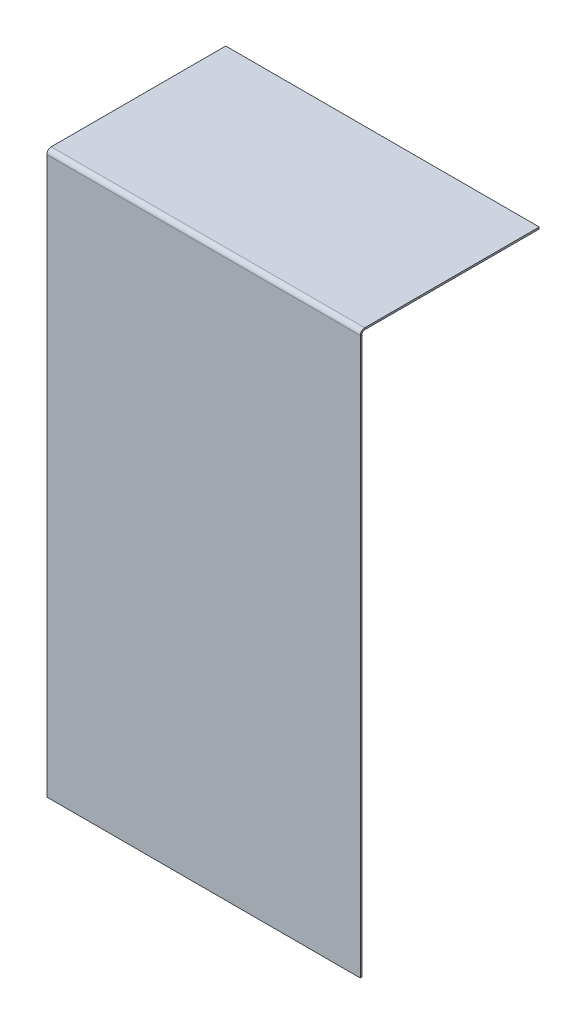
ISO-10303-21;
HEADER;
FILE_DESCRIPTION(('STEP AP214'),'2;1');
FILE_NAME('part.step','',(''),(''),'','','');
FILE_SCHEMA(('AUTOMOTIVE_DESIGN { 1 0 10303 214 1 1 1 1 }'));
ENDSEC;
DATA;
#1=APPLICATION_CONTEXT('core data for automotive mechanical design processes');
#2=APPLICATION_PROTOCOL_DEFINITION('international standard','automotive_design',2000,#1);
#3=PRODUCT_CONTEXT('',#1,'mechanical');
#4=PRODUCT('Part','Part','',(#3));
#5=PRODUCT_RELATED_PRODUCT_CATEGORY('part','',(#4));
#6=PRODUCT_DEFINITION_FORMATION('','',#4);
#7=PRODUCT_DEFINITION_CONTEXT('part definition',#1,'design');
#8=PRODUCT_DEFINITION('design','',#6,#7);
#9=PRODUCT_DEFINITION_SHAPE('','',#8);
#10=(LENGTH_UNIT() NAMED_UNIT(*) SI_UNIT(.MILLI.,.METRE.));
#11=(NAMED_UNIT(*) PLANE_ANGLE_UNIT() SI_UNIT($,.RADIAN.));
#12=(NAMED_UNIT(*) SI_UNIT($,.STERADIAN.) SOLID_ANGLE_UNIT());
#13=UNCERTAINTY_MEASURE_WITH_UNIT(LENGTH_MEASURE(1.E-05),#10,'distance_accuracy_value','');
#14=(GEOMETRIC_REPRESENTATION_CONTEXT(3) GLOBAL_UNCERTAINTY_ASSIGNED_CONTEXT((#13)) GLOBAL_UNIT_ASSIGNED_CONTEXT((#10,
#11,#12)) REPRESENTATION_CONTEXT('',''));
#15=CARTESIAN_POINT('',(0.,0.,0.));
#16=DIRECTION('',(0.,0.,1.));
#17=DIRECTION('',(1.,0.,0.));
#18=AXIS2_PLACEMENT_3D('',#15,#16,#17);
#19=CARTESIAN_POINT('',(-152.826113142533,400.785534507492,157.48));
#20=DIRECTION('',(-1.,0.,0.));
#21=DIRECTION('',(0.,-1.,0.));
#22=AXIS2_PLACEMENT_3D('',#19,#20,#21);
#23=PLANE('',#22);
#24=DIRECTION('',(0.,0.,1.));
#25=VECTOR('',#24,1.);
#26=CARTESIAN_POINT('',(-152.826113142533,398.405534441492,157.48));
#27=LINE('',#26,#25);
#28=CARTESIAN_POINT('',(-152.826113142533,398.405534441492,157.48));
#29=VERTEX_POINT('',#28);
#30=CARTESIAN_POINT('',(-152.826113142533,398.405534441492,159.0675));
#31=VERTEX_POINT('',#30);
#32=EDGE_CURVE('E11',#29,#31,#27,.T.);
#33=ORIENTED_EDGE('',*,*,#32,.F.);
#34=DIRECTION('',(0.,-1.,0.));
#35=VECTOR('',#34,1.);
#36=CARTESIAN_POINT('',(-152.826113142533,400.785534507492,157.48));
#37=LINE('',#36,#35);
#38=CARTESIAN_POINT('',(-152.826113142533,-96.1019654925084,157.48));
#39=VERTEX_POINT('',#38);
#40=EDGE_CURVE('E152',#29,#39,#37,.T.);
#41=ORIENTED_EDGE('',*,*,#40,.T.);
#42=DIRECTION('',(0.,0.,1.));
#43=VECTOR('',#42,1.);
#44=CARTESIAN_POINT('',(-152.826113142533,-96.1019654925084,157.48));
#45=LINE('',#44,#43);
#46=CARTESIAN_POINT('',(-152.826113142533,-96.1019654925084,159.0675));
#47=VERTEX_POINT('',#46);
#48=EDGE_CURVE('E45',#39,#47,#45,.T.);
#49=ORIENTED_EDGE('',*,*,#48,.T.);
#50=DIRECTION('',(0.,-1.,0.));
#51=VECTOR('',#50,1.);
#52=CARTESIAN_POINT('',(-152.826113142533,400.785534507492,159.0675));
#53=LINE('',#52,#51);
#54=EDGE_CURVE('E128',#31,#47,#53,.T.);
#55=ORIENTED_EDGE('',*,*,#54,.F.);
#56=EDGE_LOOP('',(#33,#41,#49,#55));
#57=FACE_BOUND('',#56,.T.);
#58=ADVANCED_FACE('F35',(#57),#23,.T.);
#59=CARTESIAN_POINT('',(-152.826113142533,-96.1019654925084,157.48));
#60=DIRECTION('',(0.,-1.,0.));
#61=DIRECTION('',(1.,0.,0.));
#62=AXIS2_PLACEMENT_3D('',#59,#60,#61);
#63=PLANE('',#62);
#64=ORIENTED_EDGE('',*,*,#48,.F.);
#65=DIRECTION('',(1.,0.,0.));
#66=VECTOR('',#65,1.);
#67=CARTESIAN_POINT('',(-152.826113142533,-96.1019654925084,157.48));
#68=LINE('',#67,#66);
#69=CARTESIAN_POINT('',(125.781386791467,-96.1019654925084,157.48));
#70=VERTEX_POINT('',#69);
#71=EDGE_CURVE('E154',#39,#70,#68,.T.);
#72=ORIENTED_EDGE('',*,*,#71,.T.);
#73=DIRECTION('',(0.,0.,1.));
#74=VECTOR('',#73,1.);
#75=CARTESIAN_POINT('',(125.781386791467,-96.1019654925084,157.48));
#76=LINE('',#75,#74);
#77=CARTESIAN_POINT('',(125.781386791467,-96.1019654925085,159.0675));
#78=VERTEX_POINT('',#77);
#79=EDGE_CURVE('E180',#70,#78,#76,.T.);
#80=ORIENTED_EDGE('',*,*,#79,.T.);
#81=DIRECTION('',(1.,0.,0.));
#82=VECTOR('',#81,1.);
#83=CARTESIAN_POINT('',(-155.206113208533,-96.1019654925084,159.0675));
#84=LINE('',#83,#82);
#85=EDGE_CURVE('E132',#47,#78,#84,.T.);
#86=ORIENTED_EDGE('',*,*,#85,.F.);
#87=EDGE_LOOP('',(#64,#72,#80,#86));
#88=FACE_BOUND('',#87,.T.);
#89=ADVANCED_FACE('F183',(#88),#63,.T.);
#90=CARTESIAN_POINT('',(125.781386791467,400.785534507492,157.48));
#91=DIRECTION('',(1.,0.,0.));
#92=DIRECTION('',(0.,1.,0.));
#93=AXIS2_PLACEMENT_3D('',#90,#91,#92);
#94=PLANE('',#93);
#95=ORIENTED_EDGE('',*,*,#79,.F.);
#96=DIRECTION('',(0.,1.,0.));
#97=VECTOR('',#96,1.);
#98=CARTESIAN_POINT('',(125.781386791467,400.785534507492,157.48));
#99=LINE('',#98,#97);
#100=CARTESIAN_POINT('',(125.781386791467,398.405534441492,157.48));
#101=VERTEX_POINT('',#100);
#102=EDGE_CURVE('E158',#70,#101,#99,.T.);
#103=ORIENTED_EDGE('',*,*,#102,.T.);
#104=DIRECTION('',(0.,0.,1.));
#105=VECTOR('',#104,1.);
#106=CARTESIAN_POINT('',(125.781386791467,398.405534441492,157.48));
#107=LINE('',#106,#105);
#108=CARTESIAN_POINT('',(125.781386791467,398.405534441492,159.0675));
#109=VERTEX_POINT('',#108);
#110=EDGE_CURVE('E178',#101,#109,#107,.T.);
#111=ORIENTED_EDGE('',*,*,#110,.T.);
#112=DIRECTION('',(0.,-1.,0.));
#113=VECTOR('',#112,1.);
#114=CARTESIAN_POINT('',(125.781386791467,400.785534507492,159.0675));
#115=LINE('',#114,#113);
#116=EDGE_CURVE('E137',#78,#109,#115,.F.);
#117=ORIENTED_EDGE('',*,*,#116,.F.);
#118=EDGE_LOOP('',(#95,#103,#111,#117));
#119=FACE_BOUND('',#118,.T.);
#120=ADVANCED_FACE('F187',(#119),#94,.T.);
#121=CARTESIAN_POINT('',(125.781386791467,398.405534441492,155.099999934));
#122=DIRECTION('',(-1.,0.,0.));
#123=DIRECTION('',(0.,-1.,0.));
#124=AXIS2_PLACEMENT_3D('',#121,#122,#123);
#125=PLANE('',#124);
#126=ORIENTED_EDGE('',*,*,#110,.F.);
#127=CARTESIAN_POINT('',(125.781386791467,398.405534441492,155.099999934));
#128=DIRECTION('',(1.,0.,0.));
#129=DIRECTION('',(0.,1.,0.));
#130=AXIS2_PLACEMENT_3D('',#127,#128,#129);
#131=CIRCLE('',#130,2.380000066);
#132=CARTESIAN_POINT('',(125.781386791467,400.785534507492,155.099999934));
#133=VERTEX_POINT('',#132);
#134=EDGE_CURVE('E155',#101,#133,#131,.F.);
#135=ORIENTED_EDGE('',*,*,#134,.T.);
#136=DIRECTION('',(0.,1.,0.));
#137=VECTOR('',#136,1.);
#138=CARTESIAN_POINT('',(125.781386791467,400.785534507492,155.099999934));
#139=LINE('',#138,#137);
#140=CARTESIAN_POINT('',(125.781386791467,402.373034507492,155.099999934));
#141=VERTEX_POINT('',#140);
#142=EDGE_CURVE('E83',#133,#141,#139,.T.);
#143=ORIENTED_EDGE('',*,*,#142,.T.);
#144=CARTESIAN_POINT('',(125.781386791467,398.405534441492,155.099999934));
#145=DIRECTION('',(1.,0.,0.));
#146=DIRECTION('',(0.,0.,-1.));
#147=AXIS2_PLACEMENT_3D('',#144,#145,#146);
#148=CIRCLE('',#147,3.967500066);
#149=EDGE_CURVE('E125',#109,#141,#148,.F.);
#150=ORIENTED_EDGE('',*,*,#149,.F.);
#151=EDGE_LOOP('',(#126,#135,#143,#150));
#152=FACE_BOUND('',#151,.T.);
#153=ADVANCED_FACE('F190',(#152),#125,.F.);
#154=CARTESIAN_POINT('',(125.781386791467,400.785534507492,727.1459781624));
#155=DIRECTION('',(-1.,0.,0.));
#156=DIRECTION('',(0.,0.,-1.));
#157=AXIS2_PLACEMENT_3D('',#154,#155,#156);
#158=PLANE('',#157);
#159=ORIENTED_EDGE('',*,*,#142,.F.);
#160=DIRECTION('',(0.,0.,-1.));
#161=VECTOR('',#160,1.);
#162=CARTESIAN_POINT('',(125.781386791467,400.785534507492,727.1459781624));
#163=LINE('',#162,#161);
#164=CARTESIAN_POINT('',(125.781386791467,400.785534507492,0.));
#165=VERTEX_POINT('',#164);
#166=EDGE_CURVE('E161',#133,#165,#163,.T.);
#167=ORIENTED_EDGE('',*,*,#166,.T.);
#168=DIRECTION('',(0.,1.,0.));
#169=VECTOR('',#168,1.);
#170=CARTESIAN_POINT('',(125.781386791467,400.785534507492,0.));
#171=LINE('',#170,#169);
#172=CARTESIAN_POINT('',(125.781386791467,402.373034507492,0.));
#173=VERTEX_POINT('',#172);
#174=EDGE_CURVE('E175',#165,#173,#171,.T.);
#175=ORIENTED_EDGE('',*,*,#174,.T.);
#176=DIRECTION('',(0.,0.,-1.));
#177=VECTOR('',#176,1.);
#178=CARTESIAN_POINT('',(125.781386791467,402.373034507492,727.1459781624));
#179=LINE('',#178,#177);
#180=EDGE_CURVE('E146',#141,#173,#179,.T.);
#181=ORIENTED_EDGE('',*,*,#180,.F.);
#182=EDGE_LOOP('',(#159,#167,#175,#181));
#183=FACE_BOUND('',#182,.T.);
#184=ADVANCED_FACE('F201',(#183),#158,.F.);
#185=CARTESIAN_POINT('',(-152.826113142533,400.785534507492,0.));
#186=DIRECTION('',(0.,0.,1.));
#187=DIRECTION('',(-1.,0.,0.));
#188=AXIS2_PLACEMENT_3D('',#185,#186,#187);
#189=PLANE('',#188);
#190=ORIENTED_EDGE('',*,*,#174,.F.);
#191=DIRECTION('',(-1.,0.,0.));
#192=VECTOR('',#191,1.);
#193=CARTESIAN_POINT('',(-152.826113142533,400.785534507492,0.));
#194=LINE('',#193,#192);
#195=CARTESIAN_POINT('',(-152.826113142533,400.785534507492,0.));
#196=VERTEX_POINT('',#195);
#197=EDGE_CURVE('E163',#165,#196,#194,.T.);
#198=ORIENTED_EDGE('',*,*,#197,.T.);
#199=DIRECTION('',(0.,1.,0.));
#200=VECTOR('',#199,1.);
#201=CARTESIAN_POINT('',(-152.826113142533,400.785534507492,0.));
#202=LINE('',#201,#200);
#203=CARTESIAN_POINT('',(-152.826113142533,402.373034507492,0.));
#204=VERTEX_POINT('',#203);
#205=EDGE_CURVE('E108',#196,#204,#202,.T.);
#206=ORIENTED_EDGE('',*,*,#205,.T.);
#207=DIRECTION('',(1.,0.,0.));
#208=VECTOR('',#207,1.);
#209=CARTESIAN_POINT('',(-152.826113142533,402.373034507492,0.));
#210=LINE('',#209,#208);
#211=EDGE_CURVE('E142',#173,#204,#210,.F.);
#212=ORIENTED_EDGE('',*,*,#211,.F.);
#213=EDGE_LOOP('',(#190,#198,#206,#212));
#214=FACE_BOUND('',#213,.T.);
#215=ADVANCED_FACE('F204',(#214),#189,.F.);
#216=CARTESIAN_POINT('',(-152.826113142533,400.785534507492,727.1459781624));
#217=DIRECTION('',(-1.,0.,0.));
#218=DIRECTION('',(0.,0.,-1.));
#219=AXIS2_PLACEMENT_3D('',#216,#217,#218);
#220=PLANE('',#219);
#221=ORIENTED_EDGE('',*,*,#205,.F.);
#222=DIRECTION('',(0.,0.,-1.));
#223=VECTOR('',#222,1.);
#224=CARTESIAN_POINT('',(-152.826113142533,400.785534507492,727.1459781624));
#225=LINE('',#224,#223);
#226=CARTESIAN_POINT('',(-152.826113142533,400.785534507492,155.099999934));
#227=VERTEX_POINT('',#226);
#228=EDGE_CURVE('E165',#227,#196,#225,.T.);
#229=ORIENTED_EDGE('',*,*,#228,.F.);
#230=DIRECTION('',(0.,1.,0.));
#231=VECTOR('',#230,1.);
#232=CARTESIAN_POINT('',(-152.826113142533,400.785534507492,155.099999934));
#233=LINE('',#232,#231);
#234=CARTESIAN_POINT('',(-152.826113142533,402.373034507492,155.099999934));
#235=VERTEX_POINT('',#234);
#236=EDGE_CURVE('E39',#227,#235,#233,.T.);
#237=ORIENTED_EDGE('',*,*,#236,.T.);
#238=DIRECTION('',(0.,0.,-1.));
#239=VECTOR('',#238,1.);
#240=CARTESIAN_POINT('',(-152.826113142533,402.373034507492,727.1459781624));
#241=LINE('',#240,#239);
#242=EDGE_CURVE('E139',#235,#204,#241,.T.);
#243=ORIENTED_EDGE('',*,*,#242,.T.);
#244=EDGE_LOOP('',(#221,#229,#237,#243));
#245=FACE_BOUND('',#244,.T.);
#246=ADVANCED_FACE('F206',(#245),#220,.T.);
#247=CARTESIAN_POINT('',(-152.826113142533,398.405534441492,155.099999934));
#248=DIRECTION('',(-1.,0.,0.));
#249=DIRECTION('',(0.,-1.,0.));
#250=AXIS2_PLACEMENT_3D('',#247,#248,#249);
#251=PLANE('',#250);
#252=CARTESIAN_POINT('',(-152.826113142533,398.405534441492,155.099999934));
#253=DIRECTION('',(1.,0.,0.));
#254=DIRECTION('',(0.,1.,0.));
#255=AXIS2_PLACEMENT_3D('',#252,#253,#254);
#256=CIRCLE('',#255,2.380000066);
#257=EDGE_CURVE('E114',#227,#29,#256,.T.);
#258=ORIENTED_EDGE('',*,*,#257,.T.);
#259=ORIENTED_EDGE('',*,*,#32,.T.);
#260=CARTESIAN_POINT('',(-152.826113142533,398.405534441492,155.099999934));
#261=DIRECTION('',(1.,0.,0.));
#262=DIRECTION('',(0.,0.,-1.));
#263=AXIS2_PLACEMENT_3D('',#260,#261,#262);
#264=CIRCLE('',#263,3.967500066);
#265=EDGE_CURVE('E111',#235,#31,#264,.T.);
#266=ORIENTED_EDGE('',*,*,#265,.F.);
#267=ORIENTED_EDGE('',*,*,#236,.F.);
#268=EDGE_LOOP('',(#258,#259,#266,#267));
#269=FACE_BOUND('',#268,.T.);
#270=ADVANCED_FACE('F37',(#269),#251,.T.);
#271=CARTESIAN_POINT('',(-152.826113142533,402.373034507492,727.1459781624));
#272=DIRECTION('',(0.,-1.,0.));
#273=DIRECTION('',(0.,0.,-1.));
#274=AXIS2_PLACEMENT_3D('',#271,#272,#273);
#275=PLANE('',#274);
#276=ORIENTED_EDGE('',*,*,#242,.F.);
#277=DIRECTION('',(1.,0.,0.));
#278=VECTOR('',#277,1.);
#279=CARTESIAN_POINT('',(-152.826113142533,402.373034507492,155.099999934));
#280=LINE('',#279,#278);
#281=EDGE_CURVE('E124',#235,#141,#280,.T.);
#282=ORIENTED_EDGE('',*,*,#281,.T.);
#283=ORIENTED_EDGE('',*,*,#180,.T.);
#284=ORIENTED_EDGE('',*,*,#211,.T.);
#285=EDGE_LOOP('',(#276,#282,#283,#284));
#286=FACE_BOUND('',#285,.T.);
#287=ADVANCED_FACE('F203',(#286),#275,.F.);
#288=CARTESIAN_POINT('',(-155.206113208533,400.785534507492,159.0675));
#289=DIRECTION('',(0.,0.,1.));
#290=DIRECTION('',(0.,-1.,0.));
#291=AXIS2_PLACEMENT_3D('',#288,#289,#290);
#292=PLANE('',#291);
#293=ORIENTED_EDGE('',*,*,#116,.T.);
#294=DIRECTION('',(1.,0.,0.));
#295=VECTOR('',#294,1.);
#296=CARTESIAN_POINT('',(-155.206113208533,398.405534441492,159.0675));
#297=LINE('',#296,#295);
#298=EDGE_CURVE('E122',#109,#31,#297,.F.);
#299=ORIENTED_EDGE('',*,*,#298,.T.);
#300=ORIENTED_EDGE('',*,*,#54,.T.);
#301=ORIENTED_EDGE('',*,*,#85,.T.);
#302=EDGE_LOOP('',(#293,#299,#300,#301));
#303=FACE_BOUND('',#302,.T.);
#304=ADVANCED_FACE('F135',(#303),#292,.T.);
#305=CARTESIAN_POINT('',(-155.206113208533,398.405534441492,155.099999934));
#306=DIRECTION('',(1.,0.,0.));
#307=DIRECTION('',(0.,0.,-1.));
#308=AXIS2_PLACEMENT_3D('',#305,#306,#307);
#309=CYLINDRICAL_SURFACE('',#308,3.967500066);
#310=ORIENTED_EDGE('',*,*,#149,.T.);
#311=ORIENTED_EDGE('',*,*,#281,.F.);
#312=ORIENTED_EDGE('',*,*,#265,.T.);
#313=ORIENTED_EDGE('',*,*,#298,.F.);
#314=EDGE_LOOP('',(#310,#311,#312,#313));
#315=FACE_BOUND('',#314,.T.);
#316=ADVANCED_FACE('F120',(#315),#309,.T.);
#317=CARTESIAN_POINT('',(-152.826113142533,400.785534507492,727.1459781624));
#318=DIRECTION('',(0.,-1.,0.));
#319=DIRECTION('',(0.,0.,-1.));
#320=AXIS2_PLACEMENT_3D('',#317,#318,#319);
#321=PLANE('',#320);
#322=ORIENTED_EDGE('',*,*,#228,.T.);
#323=ORIENTED_EDGE('',*,*,#197,.F.);
#324=ORIENTED_EDGE('',*,*,#166,.F.);
#325=DIRECTION('',(-1.,0.,0.));
#326=VECTOR('',#325,1.);
#327=CARTESIAN_POINT('',(125.781386791467,400.785534507492,155.099999934));
#328=LINE('',#327,#326);
#329=EDGE_CURVE('E126',#227,#133,#328,.F.);
#330=ORIENTED_EDGE('',*,*,#329,.F.);
#331=EDGE_LOOP('',(#322,#323,#324,#330));
#332=FACE_BOUND('',#331,.T.);
#333=ADVANCED_FACE('F200',(#332),#321,.T.);
#334=CARTESIAN_POINT('',(-155.206113208533,400.785534507492,157.48));
#335=DIRECTION('',(0.,0.,1.));
#336=DIRECTION('',(0.,-1.,0.));
#337=AXIS2_PLACEMENT_3D('',#334,#335,#336);
#338=PLANE('',#337);
#339=ORIENTED_EDGE('',*,*,#102,.F.);
#340=ORIENTED_EDGE('',*,*,#71,.F.);
#341=ORIENTED_EDGE('',*,*,#40,.F.);
#342=DIRECTION('',(-1.,0.,0.));
#343=VECTOR('',#342,1.);
#344=CARTESIAN_POINT('',(-152.826113142533,398.405534441492,157.48));
#345=LINE('',#344,#343);
#346=EDGE_CURVE('E168',#101,#29,#345,.T.);
#347=ORIENTED_EDGE('',*,*,#346,.F.);
#348=EDGE_LOOP('',(#339,#340,#341,#347));
#349=FACE_BOUND('',#348,.T.);
#350=ADVANCED_FACE('F194',(#349),#338,.F.);
#351=CARTESIAN_POINT('',(-155.206113208533,398.405534441492,155.099999934));
#352=DIRECTION('',(1.,0.,0.));
#353=DIRECTION('',(0.,0.,-1.));
#354=AXIS2_PLACEMENT_3D('',#351,#352,#353);
#355=CYLINDRICAL_SURFACE('',#354,2.380000066);
#356=ORIENTED_EDGE('',*,*,#134,.F.);
#357=ORIENTED_EDGE('',*,*,#346,.T.);
#358=ORIENTED_EDGE('',*,*,#257,.F.);
#359=ORIENTED_EDGE('',*,*,#329,.T.);
#360=EDGE_LOOP('',(#356,#357,#358,#359));
#361=FACE_BOUND('',#360,.T.);
#362=ADVANCED_FACE('F196',(#361),#355,.F.);
#363=CLOSED_SHELL('',(#58,#89,#120,#153,#184,#215,#246,#270,#287,#304,#316,#333,#350,#362));
#364=MANIFOLD_SOLID_BREP('B2',#363);
#365=ADVANCED_BREP_SHAPE_REPRESENTATION('',(#18,#364),#14);
#366=SHAPE_DEFINITION_REPRESENTATION(#9,#365);
ENDSEC;
END-ISO-10303-21;
